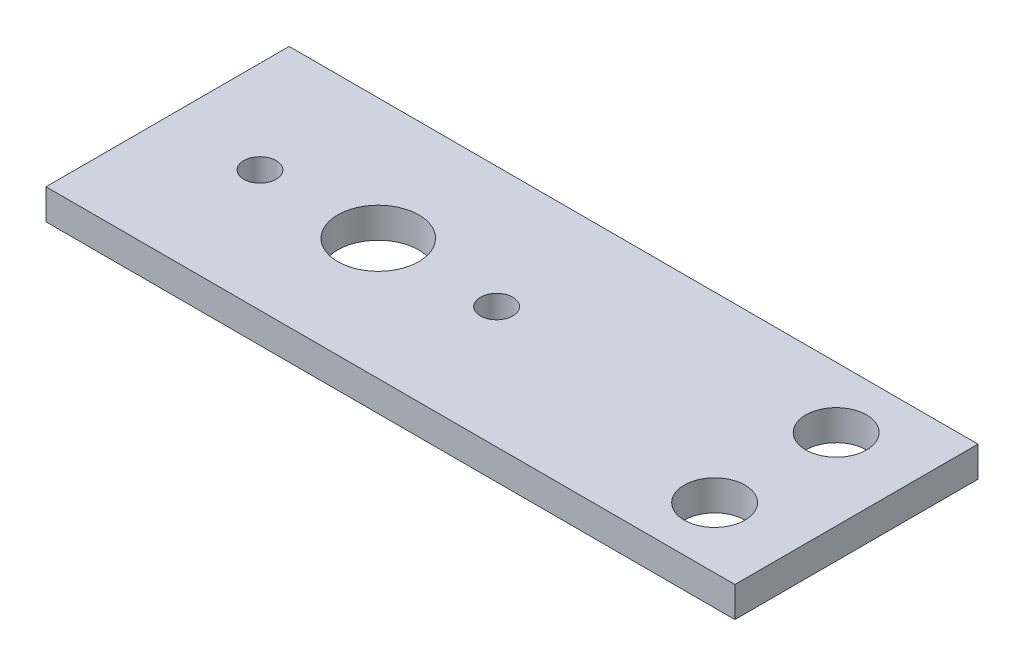
ISO-10303-21;
HEADER;
FILE_DESCRIPTION(('STEP AP214'),'2;1');
FILE_NAME('part.step','',(''),(''),'','','');
FILE_SCHEMA(('AUTOMOTIVE_DESIGN { 1 0 10303 214 1 1 1 1 }'));
ENDSEC;
DATA;
#1=APPLICATION_CONTEXT('core data for automotive mechanical design processes');
#2=APPLICATION_PROTOCOL_DEFINITION('international standard','automotive_design',2000,#1);
#3=PRODUCT_CONTEXT('',#1,'mechanical');
#4=PRODUCT('Part','Part','',(#3));
#5=PRODUCT_RELATED_PRODUCT_CATEGORY('part','',(#4));
#6=PRODUCT_DEFINITION_FORMATION('','',#4);
#7=PRODUCT_DEFINITION_CONTEXT('part definition',#1,'design');
#8=PRODUCT_DEFINITION('design','',#6,#7);
#9=PRODUCT_DEFINITION_SHAPE('','',#8);
#10=(LENGTH_UNIT() NAMED_UNIT(*) SI_UNIT(.MILLI.,.METRE.));
#11=(NAMED_UNIT(*) PLANE_ANGLE_UNIT() SI_UNIT($,.RADIAN.));
#12=(NAMED_UNIT(*) SI_UNIT($,.STERADIAN.) SOLID_ANGLE_UNIT());
#13=UNCERTAINTY_MEASURE_WITH_UNIT(LENGTH_MEASURE(1.E-05),#10,'distance_accuracy_value','');
#14=(GEOMETRIC_REPRESENTATION_CONTEXT(3) GLOBAL_UNCERTAINTY_ASSIGNED_CONTEXT((#13)) GLOBAL_UNIT_ASSIGNED_CONTEXT((#10,
#11,#12)) REPRESENTATION_CONTEXT('',''));
#15=CARTESIAN_POINT('',(0.,0.,0.));
#16=DIRECTION('',(0.,0.,1.));
#17=DIRECTION('',(1.,0.,0.));
#18=AXIS2_PLACEMENT_3D('',#15,#16,#17);
#19=CARTESIAN_POINT('',(0.,4.7625,0.));
#20=DIRECTION('',(0.,-1.,0.));
#21=DIRECTION('',(0.,0.,-1.));
#22=AXIS2_PLACEMENT_3D('',#19,#20,#21);
#23=PLANE('',#22);
#24=CARTESIAN_POINT('',(-39.497,4.7625,0.));
#25=DIRECTION('',(0.,1.,0.));
#26=DIRECTION('',(0.,0.,1.));
#27=AXIS2_PLACEMENT_3D('',#24,#25,#26);
#28=CIRCLE('',#27,2.54);
#29=CARTESIAN_POINT('',(-39.497,4.7625,2.54));
#30=VERTEX_POINT('',#29);
#31=EDGE_CURVE('E165',#30,#30,#28,.T.);
#32=ORIENTED_EDGE('',*,*,#31,.F.);
#33=EDGE_LOOP('',(#32));
#34=FACE_BOUND('',#33,.T.);
#35=CARTESIAN_POINT('',(-2.41299999999999,4.7625,0.));
#36=DIRECTION('',(0.,1.,0.));
#37=DIRECTION('',(0.,0.,1.));
#38=AXIS2_PLACEMENT_3D('',#35,#36,#37);
#39=CIRCLE('',#38,2.54);
#40=CARTESIAN_POINT('',(-2.41299999999999,4.7625,2.54));
#41=VERTEX_POINT('',#40);
#42=EDGE_CURVE('E161',#41,#41,#39,.T.);
#43=ORIENTED_EDGE('',*,*,#42,.F.);
#44=EDGE_LOOP('',(#43));
#45=FACE_BOUND('',#44,.T.);
#46=CARTESIAN_POINT('',(-20.955,4.7625,0.));
#47=DIRECTION('',(0.,1.,0.));
#48=DIRECTION('',(0.,0.,1.));
#49=AXIS2_PLACEMENT_3D('',#46,#47,#48);
#50=CIRCLE('',#49,6.35);
#51=CARTESIAN_POINT('',(-20.955,4.7625,6.35));
#52=VERTEX_POINT('',#51);
#53=EDGE_CURVE('E153',#52,#52,#50,.T.);
#54=ORIENTED_EDGE('',*,*,#53,.F.);
#55=EDGE_LOOP('',(#54));
#56=FACE_BOUND('',#55,.T.);
#57=DIRECTION('',(0.,0.,-1.));
#58=VECTOR('',#57,1.);
#59=CARTESIAN_POINT('',(53.975,4.7625,19.05));
#60=LINE('',#59,#58);
#61=CARTESIAN_POINT('',(53.975,4.7625,19.05));
#62=VERTEX_POINT('',#61);
#63=CARTESIAN_POINT('',(53.975,4.7625,-19.05));
#64=VERTEX_POINT('',#63);
#65=EDGE_CURVE('E95',#62,#64,#60,.T.);
#66=ORIENTED_EDGE('',*,*,#65,.T.);
#67=DIRECTION('',(-1.,0.,0.));
#68=VECTOR('',#67,1.);
#69=CARTESIAN_POINT('',(-53.975,4.7625,-19.05));
#70=LINE('',#69,#68);
#71=CARTESIAN_POINT('',(-53.975,4.7625,-19.05));
#72=VERTEX_POINT('',#71);
#73=EDGE_CURVE('E90',#64,#72,#70,.T.);
#74=ORIENTED_EDGE('',*,*,#73,.T.);
#75=DIRECTION('',(0.,0.,1.));
#76=VECTOR('',#75,1.);
#77=CARTESIAN_POINT('',(-53.975,4.7625,19.05));
#78=LINE('',#77,#76);
#79=CARTESIAN_POINT('',(-53.975,4.7625,19.05));
#80=VERTEX_POINT('',#79);
#81=EDGE_CURVE('E93',#72,#80,#78,.T.);
#82=ORIENTED_EDGE('',*,*,#81,.T.);
#83=DIRECTION('',(1.,0.,0.));
#84=VECTOR('',#83,1.);
#85=CARTESIAN_POINT('',(-53.975,4.7625,19.05));
#86=LINE('',#85,#84);
#87=EDGE_CURVE('E60',#80,#62,#86,.T.);
#88=ORIENTED_EDGE('',*,*,#87,.T.);
#89=EDGE_LOOP('',(#66,#74,#82,#88));
#90=FACE_BOUND('',#89,.T.);
#91=CARTESIAN_POINT('',(41.275,4.7625,-9.525));
#92=DIRECTION('',(0.,1.,0.));
#93=DIRECTION('',(0.,0.,1.));
#94=AXIS2_PLACEMENT_3D('',#91,#92,#93);
#95=CIRCLE('',#94,4.7625);
#96=CARTESIAN_POINT('',(41.275,4.7625,-14.2875));
#97=VERTEX_POINT('',#96);
#98=EDGE_CURVE('E115',#97,#97,#95,.T.);
#99=ORIENTED_EDGE('',*,*,#98,.F.);
#100=EDGE_LOOP('',(#99));
#101=FACE_BOUND('',#100,.T.);
#102=CARTESIAN_POINT('',(41.275,4.7625,9.52499999999998));
#103=DIRECTION('',(0.,1.,0.));
#104=DIRECTION('',(0.,0.,-1.));
#105=AXIS2_PLACEMENT_3D('',#102,#103,#104);
#106=CIRCLE('',#105,4.7625);
#107=CARTESIAN_POINT('',(41.275,4.7625,4.76249999999997));
#108=VERTEX_POINT('',#107);
#109=EDGE_CURVE('E137',#108,#108,#106,.T.);
#110=ORIENTED_EDGE('',*,*,#109,.F.);
#111=EDGE_LOOP('',(#110));
#112=FACE_BOUND('',#111,.T.);
#113=ADVANCED_FACE('F42',(#34,#45,#56,#90,#101,#112),#23,.F.);
#114=CARTESIAN_POINT('',(0.,0.,0.));
#115=DIRECTION('',(0.,-1.,0.));
#116=DIRECTION('',(0.,0.,-1.));
#117=AXIS2_PLACEMENT_3D('',#114,#115,#116);
#118=PLANE('',#117);
#119=CARTESIAN_POINT('',(-39.497,0.,0.));
#120=DIRECTION('',(0.,1.,0.));
#121=DIRECTION('',(0.,0.,1.));
#122=AXIS2_PLACEMENT_3D('',#119,#120,#121);
#123=CIRCLE('',#122,2.54);
#124=CARTESIAN_POINT('',(-39.497,0.,2.54));
#125=VERTEX_POINT('',#124);
#126=EDGE_CURVE('E145',#125,#125,#123,.T.);
#127=ORIENTED_EDGE('',*,*,#126,.T.);
#128=EDGE_LOOP('',(#127));
#129=FACE_BOUND('',#128,.T.);
#130=CARTESIAN_POINT('',(-2.41299999999999,0.,0.));
#131=DIRECTION('',(0.,1.,0.));
#132=DIRECTION('',(0.,0.,1.));
#133=AXIS2_PLACEMENT_3D('',#130,#131,#132);
#134=CIRCLE('',#133,2.54);
#135=CARTESIAN_POINT('',(-2.41299999999999,0.,2.54));
#136=VERTEX_POINT('',#135);
#137=EDGE_CURVE('E157',#136,#136,#134,.T.);
#138=ORIENTED_EDGE('',*,*,#137,.T.);
#139=EDGE_LOOP('',(#138));
#140=FACE_BOUND('',#139,.T.);
#141=CARTESIAN_POINT('',(-20.955,0.,0.));
#142=DIRECTION('',(0.,1.,0.));
#143=DIRECTION('',(0.,0.,1.));
#144=AXIS2_PLACEMENT_3D('',#141,#142,#143);
#145=CIRCLE('',#144,6.35);
#146=CARTESIAN_POINT('',(-20.955,0.,6.35));
#147=VERTEX_POINT('',#146);
#148=EDGE_CURVE('E149',#147,#147,#145,.T.);
#149=ORIENTED_EDGE('',*,*,#148,.T.);
#150=EDGE_LOOP('',(#149));
#151=FACE_BOUND('',#150,.T.);
#152=CARTESIAN_POINT('',(41.275,0.,-9.525));
#153=DIRECTION('',(0.,1.,0.));
#154=DIRECTION('',(0.,0.,1.));
#155=AXIS2_PLACEMENT_3D('',#152,#153,#154);
#156=CIRCLE('',#155,4.7625);
#157=CARTESIAN_POINT('',(41.275,0.,-14.2875));
#158=VERTEX_POINT('',#157);
#159=EDGE_CURVE('E133',#158,#158,#156,.T.);
#160=ORIENTED_EDGE('',*,*,#159,.T.);
#161=EDGE_LOOP('',(#160));
#162=FACE_BOUND('',#161,.T.);
#163=DIRECTION('',(0.,0.,-1.));
#164=VECTOR('',#163,1.);
#165=CARTESIAN_POINT('',(53.975,0.,19.05));
#166=LINE('',#165,#164);
#167=CARTESIAN_POINT('',(53.975,0.,19.05));
#168=VERTEX_POINT('',#167);
#169=CARTESIAN_POINT('',(53.975,0.,-19.05));
#170=VERTEX_POINT('',#169);
#171=EDGE_CURVE('E111',#168,#170,#166,.T.);
#172=ORIENTED_EDGE('',*,*,#171,.F.);
#173=DIRECTION('',(1.,0.,0.));
#174=VECTOR('',#173,1.);
#175=CARTESIAN_POINT('',(-53.975,0.,19.05));
#176=LINE('',#175,#174);
#177=CARTESIAN_POINT('',(-53.975,0.,19.05));
#178=VERTEX_POINT('',#177);
#179=EDGE_CURVE('E83',#178,#168,#176,.T.);
#180=ORIENTED_EDGE('',*,*,#179,.F.);
#181=DIRECTION('',(0.,0.,1.));
#182=VECTOR('',#181,1.);
#183=CARTESIAN_POINT('',(-53.975,0.,19.05));
#184=LINE('',#183,#182);
#185=CARTESIAN_POINT('',(-53.975,0.,-19.05));
#186=VERTEX_POINT('',#185);
#187=EDGE_CURVE('E77',#186,#178,#184,.T.);
#188=ORIENTED_EDGE('',*,*,#187,.F.);
#189=DIRECTION('',(-1.,0.,0.));
#190=VECTOR('',#189,1.);
#191=CARTESIAN_POINT('',(-53.975,0.,-19.05));
#192=LINE('',#191,#190);
#193=EDGE_CURVE('E100',#170,#186,#192,.T.);
#194=ORIENTED_EDGE('',*,*,#193,.F.);
#195=EDGE_LOOP('',(#172,#180,#188,#194));
#196=FACE_BOUND('',#195,.T.);
#197=CARTESIAN_POINT('',(41.275,0.,9.52499999999998));
#198=DIRECTION('',(0.,1.,0.));
#199=DIRECTION('',(0.,0.,-1.));
#200=AXIS2_PLACEMENT_3D('',#197,#198,#199);
#201=CIRCLE('',#200,4.7625);
#202=CARTESIAN_POINT('',(41.275,0.,4.76249999999997));
#203=VERTEX_POINT('',#202);
#204=EDGE_CURVE('E141',#203,#203,#201,.T.);
#205=ORIENTED_EDGE('',*,*,#204,.T.);
#206=EDGE_LOOP('',(#205));
#207=FACE_BOUND('',#206,.T.);
#208=ADVANCED_FACE('F128',(#129,#140,#151,#162,#196,#207),#118,.T.);
#209=CARTESIAN_POINT('',(53.975,4.7625,19.05));
#210=DIRECTION('',(-1.,0.,0.));
#211=DIRECTION('',(0.,0.,1.));
#212=AXIS2_PLACEMENT_3D('',#209,#210,#211);
#213=PLANE('',#212);
#214=ORIENTED_EDGE('',*,*,#171,.T.);
#215=DIRECTION('',(0.,-1.,0.));
#216=VECTOR('',#215,1.);
#217=CARTESIAN_POINT('',(53.975,4.7625,-19.05));
#218=LINE('',#217,#216);
#219=EDGE_CURVE('E11',#64,#170,#218,.T.);
#220=ORIENTED_EDGE('',*,*,#219,.F.);
#221=ORIENTED_EDGE('',*,*,#65,.F.);
#222=DIRECTION('',(0.,-1.,0.));
#223=VECTOR('',#222,1.);
#224=CARTESIAN_POINT('',(53.975,4.7625,19.05));
#225=LINE('',#224,#223);
#226=EDGE_CURVE('E107',#62,#168,#225,.T.);
#227=ORIENTED_EDGE('',*,*,#226,.T.);
#228=EDGE_LOOP('',(#214,#220,#221,#227));
#229=FACE_BOUND('',#228,.T.);
#230=ADVANCED_FACE('F44',(#229),#213,.F.);
#231=CARTESIAN_POINT('',(-53.975,4.7625,-19.05));
#232=DIRECTION('',(0.,0.,1.));
#233=DIRECTION('',(1.,0.,0.));
#234=AXIS2_PLACEMENT_3D('',#231,#232,#233);
#235=PLANE('',#234);
#236=ORIENTED_EDGE('',*,*,#193,.T.);
#237=DIRECTION('',(0.,-1.,0.));
#238=VECTOR('',#237,1.);
#239=CARTESIAN_POINT('',(-53.975,4.7625,-19.05));
#240=LINE('',#239,#238);
#241=EDGE_CURVE('E52',#72,#186,#240,.T.);
#242=ORIENTED_EDGE('',*,*,#241,.F.);
#243=ORIENTED_EDGE('',*,*,#73,.F.);
#244=ORIENTED_EDGE('',*,*,#219,.T.);
#245=EDGE_LOOP('',(#236,#242,#243,#244));
#246=FACE_BOUND('',#245,.T.);
#247=ADVANCED_FACE('F99',(#246),#235,.F.);
#248=CARTESIAN_POINT('',(-53.975,4.7625,19.05));
#249=DIRECTION('',(1.,0.,0.));
#250=DIRECTION('',(0.,0.,-1.));
#251=AXIS2_PLACEMENT_3D('',#248,#249,#250);
#252=PLANE('',#251);
#253=ORIENTED_EDGE('',*,*,#187,.T.);
#254=DIRECTION('',(0.,-1.,0.));
#255=VECTOR('',#254,1.);
#256=CARTESIAN_POINT('',(-53.975,4.7625,19.05));
#257=LINE('',#256,#255);
#258=EDGE_CURVE('E102',#80,#178,#257,.T.);
#259=ORIENTED_EDGE('',*,*,#258,.F.);
#260=ORIENTED_EDGE('',*,*,#81,.F.);
#261=ORIENTED_EDGE('',*,*,#241,.T.);
#262=EDGE_LOOP('',(#253,#259,#260,#261));
#263=FACE_BOUND('',#262,.T.);
#264=ADVANCED_FACE('F103',(#263),#252,.F.);
#265=CARTESIAN_POINT('',(-53.975,4.7625,19.05));
#266=DIRECTION('',(0.,0.,-1.));
#267=DIRECTION('',(-1.,0.,0.));
#268=AXIS2_PLACEMENT_3D('',#265,#266,#267);
#269=PLANE('',#268);
#270=ORIENTED_EDGE('',*,*,#179,.T.);
#271=ORIENTED_EDGE('',*,*,#226,.F.);
#272=ORIENTED_EDGE('',*,*,#87,.F.);
#273=ORIENTED_EDGE('',*,*,#258,.T.);
#274=EDGE_LOOP('',(#270,#271,#272,#273));
#275=FACE_BOUND('',#274,.T.);
#276=ADVANCED_FACE('F125',(#275),#269,.F.);
#277=CARTESIAN_POINT('',(41.275,4.7625,-9.525));
#278=DIRECTION('',(0.,-1.,0.));
#279=DIRECTION('',(0.,0.,-1.));
#280=AXIS2_PLACEMENT_3D('',#277,#278,#279);
#281=CYLINDRICAL_SURFACE('',#280,4.7625);
#282=CARTESIAN_POINT('',(41.275,4.7625,-14.2875));
#283=CARTESIAN_POINT('',(41.275,4.712890625,-14.2875));
#284=CARTESIAN_POINT('',(41.275,4.66328125,-14.2875));
#285=CARTESIAN_POINT('',(41.275,4.5640625,-14.2875));
#286=CARTESIAN_POINT('',(41.275,4.514453125,-14.2875));
#287=CARTESIAN_POINT('',(41.275,4.415234375,-14.2875));
#288=CARTESIAN_POINT('',(41.275,4.365625,-14.2875));
#289=CARTESIAN_POINT('',(41.275,4.26640625,-14.2875));
#290=CARTESIAN_POINT('',(41.275,4.216796875,-14.2875));
#291=CARTESIAN_POINT('',(41.275,4.117578125,-14.2875));
#292=CARTESIAN_POINT('',(41.275,4.06796875,-14.2875));
#293=CARTESIAN_POINT('',(41.275,3.96875,-14.2875));
#294=CARTESIAN_POINT('',(41.275,3.919140625,-14.2875));
#295=CARTESIAN_POINT('',(41.275,3.819921875,-14.2875));
#296=CARTESIAN_POINT('',(41.275,3.7703125,-14.2875));
#297=CARTESIAN_POINT('',(41.275,3.67109375,-14.2875));
#298=CARTESIAN_POINT('',(41.275,3.621484375,-14.2875));
#299=CARTESIAN_POINT('',(41.275,3.522265625,-14.2875));
#300=CARTESIAN_POINT('',(41.275,3.47265625,-14.2875));
#301=CARTESIAN_POINT('',(41.275,3.3734375,-14.2875));
#302=CARTESIAN_POINT('',(41.275,3.323828125,-14.2875));
#303=CARTESIAN_POINT('',(41.275,3.224609375,-14.2875));
#304=CARTESIAN_POINT('',(41.275,3.175,-14.2875));
#305=CARTESIAN_POINT('',(41.275,3.07578125,-14.2875));
#306=CARTESIAN_POINT('',(41.275,3.026171875,-14.2875));
#307=CARTESIAN_POINT('',(41.275,2.926953125,-14.2875));
#308=CARTESIAN_POINT('',(41.275,2.87734375,-14.2875));
#309=CARTESIAN_POINT('',(41.275,2.778125,-14.2875));
#310=CARTESIAN_POINT('',(41.275,2.728515625,-14.2875));
#311=CARTESIAN_POINT('',(41.275,2.629296875,-14.2875));
#312=CARTESIAN_POINT('',(41.275,2.5796875,-14.2875));
#313=CARTESIAN_POINT('',(41.275,2.48046875,-14.2875));
#314=CARTESIAN_POINT('',(41.275,2.430859375,-14.2875));
#315=CARTESIAN_POINT('',(41.275,2.331640625,-14.2875));
#316=CARTESIAN_POINT('',(41.275,2.28203125,-14.2875));
#317=CARTESIAN_POINT('',(41.275,2.1828125,-14.2875));
#318=CARTESIAN_POINT('',(41.275,2.133203125,-14.2875));
#319=CARTESIAN_POINT('',(41.275,2.033984375,-14.2875));
#320=CARTESIAN_POINT('',(41.275,1.984375,-14.2875));
#321=CARTESIAN_POINT('',(41.275,1.88515625,-14.2875));
#322=CARTESIAN_POINT('',(41.275,1.835546875,-14.2875));
#323=CARTESIAN_POINT('',(41.275,1.736328125,-14.2875));
#324=CARTESIAN_POINT('',(41.275,1.68671875,-14.2875));
#325=CARTESIAN_POINT('',(41.275,1.5875,-14.2875));
#326=CARTESIAN_POINT('',(41.275,1.537890625,-14.2875));
#327=CARTESIAN_POINT('',(41.275,1.438671875,-14.2875));
#328=CARTESIAN_POINT('',(41.275,1.3890625,-14.2875));
#329=CARTESIAN_POINT('',(41.275,1.28984375,-14.2875));
#330=CARTESIAN_POINT('',(41.275,1.240234375,-14.2875));
#331=CARTESIAN_POINT('',(41.275,1.141015625,-14.2875));
#332=CARTESIAN_POINT('',(41.275,1.09140625,-14.2875));
#333=CARTESIAN_POINT('',(41.275,0.992187499999999,-14.2875));
#334=CARTESIAN_POINT('',(41.275,0.942578124999999,-14.2875));
#335=CARTESIAN_POINT('',(41.275,0.843359375,-14.2875));
#336=CARTESIAN_POINT('',(41.275,0.79375,-14.2875));
#337=CARTESIAN_POINT('',(41.275,0.69453125,-14.2875));
#338=CARTESIAN_POINT('',(41.275,0.644921875,-14.2875));
#339=CARTESIAN_POINT('',(41.275,0.545703125,-14.2875));
#340=CARTESIAN_POINT('',(41.275,0.49609375,-14.2875));
#341=CARTESIAN_POINT('',(41.275,0.396875,-14.2875));
#342=CARTESIAN_POINT('',(41.275,0.347265625,-14.2875));
#343=CARTESIAN_POINT('',(41.275,0.248046875,-14.2875));
#344=CARTESIAN_POINT('',(41.275,0.1984375,-14.2875));
#345=CARTESIAN_POINT('',(41.275,0.09921875,-14.2875));
#346=CARTESIAN_POINT('',(41.275,0.049609375,-14.2875));
#347=CARTESIAN_POINT('',(41.275,0.,-14.2875));
#348=B_SPLINE_CURVE_WITH_KNOTS('',3,(#282,#283,#284,#285,#286,#287,#288,#289,#290,#291,#292,
#293,#294,#295,#296,#297,#298,#299,#300,#301,#302,#303,#304,#305,#306,#307,#308,#309,#310,#311,
#312,#313,#314,#315,#316,#317,#318,#319,#320,#321,#322,#323,#324,#325,#326,#327,#328,#329,#330,
#331,#332,#333,#334,#335,#336,#337,#338,#339,#340,#341,#342,#343,#344,#345,#346,#347),
.UNSPECIFIED.,.F.,.F.,(4,2,2,2,2,2,2,2,2,2,2,2,2,2,2,2,2,2,2,2,2,2,2,2,2,2,2,2,2,2,2,2,4),(0.,
0.148828125,0.29765625,0.446484375,0.5953125,0.744140625,0.892968750000001,1.041796875,1.190625,
1.339453125,1.48828125,1.637109375,1.7859375,1.934765625,2.08359375,2.232421875,2.38125,
2.530078125,2.67890625,2.827734375,2.9765625,3.125390625,3.27421875,3.423046875,3.571875,
3.720703125,3.86953125,4.018359375,4.1671875,4.316015625,4.46484375,4.613671875,4.7625),.UNSPECIFIED.);
#349=EDGE_CURVE('BSEAM200',#97,#158,#348,.T.);
#350=ORIENTED_EDGE('',*,*,#98,.T.);
#351=ORIENTED_EDGE('',*,*,#159,.F.);
#352=ORIENTED_EDGE('',*,*,#349,.T.);
#353=ORIENTED_EDGE('',*,*,#349,.F.);
#354=EDGE_LOOP('',(#350,#352,#351,#353));
#355=FACE_BOUND('',#354,.T.);
#356=ADVANCED_FACE('F200',(#355),#281,.F.);
#357=CARTESIAN_POINT('',(41.275,4.7625,9.52499999999998));
#358=DIRECTION('',(0.,-1.,0.));
#359=DIRECTION('',(0.,0.,-1.));
#360=AXIS2_PLACEMENT_3D('',#357,#358,#359);
#361=CYLINDRICAL_SURFACE('',#360,4.7625);
#362=CARTESIAN_POINT('',(41.275,4.7625,4.76249999999997));
#363=CARTESIAN_POINT('',(41.275,4.712890625,4.76249999999997));
#364=CARTESIAN_POINT('',(41.275,4.66328125,4.76249999999997));
#365=CARTESIAN_POINT('',(41.275,4.5640625,4.76249999999997));
#366=CARTESIAN_POINT('',(41.275,4.514453125,4.76249999999997));
#367=CARTESIAN_POINT('',(41.275,4.415234375,4.76249999999997));
#368=CARTESIAN_POINT('',(41.275,4.365625,4.76249999999997));
#369=CARTESIAN_POINT('',(41.275,4.26640625,4.76249999999997));
#370=CARTESIAN_POINT('',(41.275,4.216796875,4.76249999999997));
#371=CARTESIAN_POINT('',(41.275,4.117578125,4.76249999999997));
#372=CARTESIAN_POINT('',(41.275,4.06796875,4.76249999999997));
#373=CARTESIAN_POINT('',(41.275,3.96875,4.76249999999997));
#374=CARTESIAN_POINT('',(41.275,3.919140625,4.76249999999997));
#375=CARTESIAN_POINT('',(41.275,3.819921875,4.76249999999997));
#376=CARTESIAN_POINT('',(41.275,3.7703125,4.76249999999997));
#377=CARTESIAN_POINT('',(41.275,3.67109375,4.76249999999997));
#378=CARTESIAN_POINT('',(41.275,3.621484375,4.76249999999997));
#379=CARTESIAN_POINT('',(41.275,3.522265625,4.76249999999997));
#380=CARTESIAN_POINT('',(41.275,3.47265625,4.76249999999997));
#381=CARTESIAN_POINT('',(41.275,3.3734375,4.76249999999997));
#382=CARTESIAN_POINT('',(41.275,3.323828125,4.76249999999997));
#383=CARTESIAN_POINT('',(41.275,3.224609375,4.76249999999997));
#384=CARTESIAN_POINT('',(41.275,3.175,4.76249999999997));
#385=CARTESIAN_POINT('',(41.275,3.07578125,4.76249999999997));
#386=CARTESIAN_POINT('',(41.275,3.026171875,4.76249999999997));
#387=CARTESIAN_POINT('',(41.275,2.926953125,4.76249999999997));
#388=CARTESIAN_POINT('',(41.275,2.87734375,4.76249999999997));
#389=CARTESIAN_POINT('',(41.275,2.778125,4.76249999999997));
#390=CARTESIAN_POINT('',(41.275,2.728515625,4.76249999999997));
#391=CARTESIAN_POINT('',(41.275,2.629296875,4.76249999999997));
#392=CARTESIAN_POINT('',(41.275,2.5796875,4.76249999999997));
#393=CARTESIAN_POINT('',(41.275,2.48046875,4.76249999999997));
#394=CARTESIAN_POINT('',(41.275,2.430859375,4.76249999999997));
#395=CARTESIAN_POINT('',(41.275,2.331640625,4.76249999999997));
#396=CARTESIAN_POINT('',(41.275,2.28203125,4.76249999999997));
#397=CARTESIAN_POINT('',(41.275,2.1828125,4.76249999999997));
#398=CARTESIAN_POINT('',(41.275,2.133203125,4.76249999999997));
#399=CARTESIAN_POINT('',(41.275,2.033984375,4.76249999999997));
#400=CARTESIAN_POINT('',(41.275,1.984375,4.76249999999997));
#401=CARTESIAN_POINT('',(41.275,1.88515625,4.76249999999997));
#402=CARTESIAN_POINT('',(41.275,1.835546875,4.76249999999997));
#403=CARTESIAN_POINT('',(41.275,1.736328125,4.76249999999997));
#404=CARTESIAN_POINT('',(41.275,1.68671875,4.76249999999997));
#405=CARTESIAN_POINT('',(41.275,1.5875,4.76249999999997));
#406=CARTESIAN_POINT('',(41.275,1.537890625,4.76249999999997));
#407=CARTESIAN_POINT('',(41.275,1.438671875,4.76249999999997));
#408=CARTESIAN_POINT('',(41.275,1.3890625,4.76249999999997));
#409=CARTESIAN_POINT('',(41.275,1.28984375,4.76249999999997));
#410=CARTESIAN_POINT('',(41.275,1.240234375,4.76249999999997));
#411=CARTESIAN_POINT('',(41.275,1.141015625,4.76249999999997));
#412=CARTESIAN_POINT('',(41.275,1.09140625,4.76249999999997));
#413=CARTESIAN_POINT('',(41.275,0.992187499999999,4.76249999999997));
#414=CARTESIAN_POINT('',(41.275,0.942578124999999,4.76249999999997));
#415=CARTESIAN_POINT('',(41.275,0.843359375,4.76249999999997));
#416=CARTESIAN_POINT('',(41.275,0.79375,4.76249999999997));
#417=CARTESIAN_POINT('',(41.275,0.69453125,4.76249999999997));
#418=CARTESIAN_POINT('',(41.275,0.644921875,4.76249999999997));
#419=CARTESIAN_POINT('',(41.275,0.545703125,4.76249999999997));
#420=CARTESIAN_POINT('',(41.275,0.49609375,4.76249999999997));
#421=CARTESIAN_POINT('',(41.275,0.396875,4.76249999999997));
#422=CARTESIAN_POINT('',(41.275,0.347265625,4.76249999999997));
#423=CARTESIAN_POINT('',(41.275,0.248046875,4.76249999999997));
#424=CARTESIAN_POINT('',(41.275,0.1984375,4.76249999999997));
#425=CARTESIAN_POINT('',(41.275,0.09921875,4.76249999999997));
#426=CARTESIAN_POINT('',(41.275,0.049609375,4.76249999999997));
#427=CARTESIAN_POINT('',(41.275,0.,4.76249999999997));
#428=B_SPLINE_CURVE_WITH_KNOTS('',3,(#362,#363,#364,#365,#366,#367,#368,#369,#370,#371,#372,
#373,#374,#375,#376,#377,#378,#379,#380,#381,#382,#383,#384,#385,#386,#387,#388,#389,#390,#391,
#392,#393,#394,#395,#396,#397,#398,#399,#400,#401,#402,#403,#404,#405,#406,#407,#408,#409,#410,
#411,#412,#413,#414,#415,#416,#417,#418,#419,#420,#421,#422,#423,#424,#425,#426,#427),
.UNSPECIFIED.,.F.,.F.,(4,2,2,2,2,2,2,2,2,2,2,2,2,2,2,2,2,2,2,2,2,2,2,2,2,2,2,2,2,2,2,2,4),(0.,
0.148828125,0.29765625,0.446484375,0.5953125,0.744140625,0.892968750000001,1.041796875,1.190625,
1.339453125,1.48828125,1.637109375,1.7859375,1.934765625,2.08359375,2.232421875,2.38125,
2.530078125,2.67890625,2.827734375,2.9765625,3.125390625,3.27421875,3.423046875,3.571875,
3.720703125,3.86953125,4.018359375,4.1671875,4.316015625,4.46484375,4.613671875,4.7625),.UNSPECIFIED.);
#429=EDGE_CURVE('BSEAM191',#108,#203,#428,.T.);
#430=ORIENTED_EDGE('',*,*,#109,.T.);
#431=ORIENTED_EDGE('',*,*,#204,.F.);
#432=ORIENTED_EDGE('',*,*,#429,.T.);
#433=ORIENTED_EDGE('',*,*,#429,.F.);
#434=EDGE_LOOP('',(#430,#432,#431,#433));
#435=FACE_BOUND('',#434,.T.);
#436=ADVANCED_FACE('F191',(#435),#361,.F.);
#437=CARTESIAN_POINT('',(-20.955,0.,0.));
#438=DIRECTION('',(0.,1.,0.));
#439=DIRECTION('',(0.,0.,1.));
#440=AXIS2_PLACEMENT_3D('',#437,#438,#439);
#441=CYLINDRICAL_SURFACE('',#440,6.35);
#442=CARTESIAN_POINT('',(-20.955,0.,6.35));
#443=CARTESIAN_POINT('',(-20.955,0.049609375,6.35));
#444=CARTESIAN_POINT('',(-20.955,0.09921875,6.35));
#445=CARTESIAN_POINT('',(-20.955,0.1984375,6.35));
#446=CARTESIAN_POINT('',(-20.955,0.248046875,6.35));
#447=CARTESIAN_POINT('',(-20.955,0.347265625,6.35));
#448=CARTESIAN_POINT('',(-20.955,0.396875,6.35));
#449=CARTESIAN_POINT('',(-20.955,0.49609375,6.35));
#450=CARTESIAN_POINT('',(-20.955,0.545703125,6.35));
#451=CARTESIAN_POINT('',(-20.955,0.644921875,6.35));
#452=CARTESIAN_POINT('',(-20.955,0.69453125,6.35));
#453=CARTESIAN_POINT('',(-20.955,0.79375,6.35));
#454=CARTESIAN_POINT('',(-20.955,0.843359375,6.35));
#455=CARTESIAN_POINT('',(-20.955,0.942578125,6.35));
#456=CARTESIAN_POINT('',(-20.955,0.9921875,6.35));
#457=CARTESIAN_POINT('',(-20.955,1.09140625,6.35));
#458=CARTESIAN_POINT('',(-20.955,1.141015625,6.35));
#459=CARTESIAN_POINT('',(-20.955,1.240234375,6.35));
#460=CARTESIAN_POINT('',(-20.955,1.28984375,6.35));
#461=CARTESIAN_POINT('',(-20.955,1.3890625,6.35));
#462=CARTESIAN_POINT('',(-20.955,1.438671875,6.35));
#463=CARTESIAN_POINT('',(-20.955,1.537890625,6.35));
#464=CARTESIAN_POINT('',(-20.955,1.5875,6.35));
#465=CARTESIAN_POINT('',(-20.955,1.68671875,6.35));
#466=CARTESIAN_POINT('',(-20.955,1.736328125,6.35));
#467=CARTESIAN_POINT('',(-20.955,1.835546875,6.35));
#468=CARTESIAN_POINT('',(-20.955,1.88515625,6.35));
#469=CARTESIAN_POINT('',(-20.955,1.984375,6.35));
#470=CARTESIAN_POINT('',(-20.955,2.033984375,6.35));
#471=CARTESIAN_POINT('',(-20.955,2.133203125,6.35));
#472=CARTESIAN_POINT('',(-20.955,2.1828125,6.35));
#473=CARTESIAN_POINT('',(-20.955,2.28203125,6.35));
#474=CARTESIAN_POINT('',(-20.955,2.331640625,6.35));
#475=CARTESIAN_POINT('',(-20.955,2.430859375,6.35));
#476=CARTESIAN_POINT('',(-20.955,2.48046875,6.35));
#477=CARTESIAN_POINT('',(-20.955,2.5796875,6.35));
#478=CARTESIAN_POINT('',(-20.955,2.629296875,6.35));
#479=CARTESIAN_POINT('',(-20.955,2.728515625,6.35));
#480=CARTESIAN_POINT('',(-20.955,2.778125,6.35));
#481=CARTESIAN_POINT('',(-20.955,2.87734375,6.35));
#482=CARTESIAN_POINT('',(-20.955,2.926953125,6.35));
#483=CARTESIAN_POINT('',(-20.955,3.026171875,6.35));
#484=CARTESIAN_POINT('',(-20.955,3.07578125,6.35));
#485=CARTESIAN_POINT('',(-20.955,3.175,6.35));
#486=CARTESIAN_POINT('',(-20.955,3.224609375,6.35));
#487=CARTESIAN_POINT('',(-20.955,3.323828125,6.35));
#488=CARTESIAN_POINT('',(-20.955,3.3734375,6.35));
#489=CARTESIAN_POINT('',(-20.955,3.47265625,6.35));
#490=CARTESIAN_POINT('',(-20.955,3.522265625,6.35));
#491=CARTESIAN_POINT('',(-20.955,3.621484375,6.35));
#492=CARTESIAN_POINT('',(-20.955,3.67109375,6.35));
#493=CARTESIAN_POINT('',(-20.955,3.7703125,6.35));
#494=CARTESIAN_POINT('',(-20.955,3.819921875,6.35));
#495=CARTESIAN_POINT('',(-20.955,3.919140625,6.35));
#496=CARTESIAN_POINT('',(-20.955,3.96875,6.35));
#497=CARTESIAN_POINT('',(-20.955,4.06796875,6.35));
#498=CARTESIAN_POINT('',(-20.955,4.117578125,6.35));
#499=CARTESIAN_POINT('',(-20.955,4.216796875,6.35));
#500=CARTESIAN_POINT('',(-20.955,4.26640625,6.35));
#501=CARTESIAN_POINT('',(-20.955,4.365625,6.35));
#502=CARTESIAN_POINT('',(-20.955,4.415234375,6.35));
#503=CARTESIAN_POINT('',(-20.955,4.514453125,6.35));
#504=CARTESIAN_POINT('',(-20.955,4.5640625,6.35));
#505=CARTESIAN_POINT('',(-20.955,4.66328125,6.35));
#506=CARTESIAN_POINT('',(-20.955,4.712890625,6.35));
#507=CARTESIAN_POINT('',(-20.955,4.7625,6.35));
#508=B_SPLINE_CURVE_WITH_KNOTS('',3,(#442,#443,#444,#445,#446,#447,#448,#449,#450,#451,#452,
#453,#454,#455,#456,#457,#458,#459,#460,#461,#462,#463,#464,#465,#466,#467,#468,#469,#470,#471,
#472,#473,#474,#475,#476,#477,#478,#479,#480,#481,#482,#483,#484,#485,#486,#487,#488,#489,#490,
#491,#492,#493,#494,#495,#496,#497,#498,#499,#500,#501,#502,#503,#504,#505,#506,#507),
.UNSPECIFIED.,.F.,.F.,(4,2,2,2,2,2,2,2,2,2,2,2,2,2,2,2,2,2,2,2,2,2,2,2,2,2,2,2,2,2,2,2,4),(0.,
0.148828125,0.29765625,0.446484375,0.5953125,0.744140625,0.89296875,1.041796875,1.190625,
1.339453125,1.48828125,1.637109375,1.7859375,1.934765625,2.08359375,2.232421875,2.38125,
2.530078125,2.67890625,2.827734375,2.9765625,3.125390625,3.27421875,3.423046875,3.571875,
3.720703125,3.86953125,4.018359375,4.1671875,4.316015625,4.46484375,4.613671875,4.7625),.UNSPECIFIED.);
#509=EDGE_CURVE('BSEAM189',#147,#52,#508,.T.);
#510=ORIENTED_EDGE('',*,*,#148,.F.);
#511=ORIENTED_EDGE('',*,*,#53,.T.);
#512=ORIENTED_EDGE('',*,*,#509,.T.);
#513=ORIENTED_EDGE('',*,*,#509,.F.);
#514=EDGE_LOOP('',(#510,#512,#511,#513));
#515=FACE_BOUND('',#514,.T.);
#516=ADVANCED_FACE('F189',(#515),#441,.F.);
#517=CARTESIAN_POINT('',(-2.41299999999999,0.,0.));
#518=DIRECTION('',(0.,1.,0.));
#519=DIRECTION('',(0.,0.,1.));
#520=AXIS2_PLACEMENT_3D('',#517,#518,#519);
#521=CYLINDRICAL_SURFACE('',#520,2.54);
#522=CARTESIAN_POINT('',(-2.41299999999999,0.,2.54));
#523=CARTESIAN_POINT('',(-2.41299999999999,0.049609375,2.54));
#524=CARTESIAN_POINT('',(-2.41299999999999,0.09921875,2.54));
#525=CARTESIAN_POINT('',(-2.41299999999999,0.1984375,2.54));
#526=CARTESIAN_POINT('',(-2.41299999999999,0.248046875,2.54));
#527=CARTESIAN_POINT('',(-2.41299999999999,0.347265625,2.54));
#528=CARTESIAN_POINT('',(-2.41299999999999,0.396875,2.54));
#529=CARTESIAN_POINT('',(-2.41299999999999,0.49609375,2.54));
#530=CARTESIAN_POINT('',(-2.41299999999999,0.545703125,2.54));
#531=CARTESIAN_POINT('',(-2.41299999999999,0.644921875,2.54));
#532=CARTESIAN_POINT('',(-2.41299999999999,0.69453125,2.54));
#533=CARTESIAN_POINT('',(-2.41299999999999,0.79375,2.54));
#534=CARTESIAN_POINT('',(-2.41299999999999,0.843359375,2.54));
#535=CARTESIAN_POINT('',(-2.41299999999999,0.942578125,2.54));
#536=CARTESIAN_POINT('',(-2.41299999999999,0.9921875,2.54));
#537=CARTESIAN_POINT('',(-2.41299999999999,1.09140625,2.54));
#538=CARTESIAN_POINT('',(-2.41299999999999,1.141015625,2.54));
#539=CARTESIAN_POINT('',(-2.41299999999999,1.240234375,2.54));
#540=CARTESIAN_POINT('',(-2.41299999999999,1.28984375,2.54));
#541=CARTESIAN_POINT('',(-2.41299999999999,1.3890625,2.54));
#542=CARTESIAN_POINT('',(-2.41299999999999,1.438671875,2.54));
#543=CARTESIAN_POINT('',(-2.41299999999999,1.537890625,2.54));
#544=CARTESIAN_POINT('',(-2.41299999999999,1.5875,2.54));
#545=CARTESIAN_POINT('',(-2.41299999999999,1.68671875,2.54));
#546=CARTESIAN_POINT('',(-2.41299999999999,1.736328125,2.54));
#547=CARTESIAN_POINT('',(-2.41299999999999,1.835546875,2.54));
#548=CARTESIAN_POINT('',(-2.41299999999999,1.88515625,2.54));
#549=CARTESIAN_POINT('',(-2.41299999999999,1.984375,2.54));
#550=CARTESIAN_POINT('',(-2.41299999999999,2.033984375,2.54));
#551=CARTESIAN_POINT('',(-2.41299999999999,2.133203125,2.54));
#552=CARTESIAN_POINT('',(-2.41299999999999,2.1828125,2.54));
#553=CARTESIAN_POINT('',(-2.41299999999999,2.28203125,2.54));
#554=CARTESIAN_POINT('',(-2.41299999999999,2.331640625,2.54));
#555=CARTESIAN_POINT('',(-2.41299999999999,2.430859375,2.54));
#556=CARTESIAN_POINT('',(-2.41299999999999,2.48046875,2.54));
#557=CARTESIAN_POINT('',(-2.41299999999999,2.5796875,2.54));
#558=CARTESIAN_POINT('',(-2.41299999999999,2.629296875,2.54));
#559=CARTESIAN_POINT('',(-2.41299999999999,2.728515625,2.54));
#560=CARTESIAN_POINT('',(-2.41299999999999,2.778125,2.54));
#561=CARTESIAN_POINT('',(-2.41299999999999,2.87734375,2.54));
#562=CARTESIAN_POINT('',(-2.41299999999999,2.926953125,2.54));
#563=CARTESIAN_POINT('',(-2.41299999999999,3.026171875,2.54));
#564=CARTESIAN_POINT('',(-2.41299999999999,3.07578125,2.54));
#565=CARTESIAN_POINT('',(-2.41299999999999,3.175,2.54));
#566=CARTESIAN_POINT('',(-2.41299999999999,3.224609375,2.54));
#567=CARTESIAN_POINT('',(-2.41299999999999,3.323828125,2.54));
#568=CARTESIAN_POINT('',(-2.41299999999999,3.3734375,2.54));
#569=CARTESIAN_POINT('',(-2.41299999999999,3.47265625,2.54));
#570=CARTESIAN_POINT('',(-2.41299999999999,3.522265625,2.54));
#571=CARTESIAN_POINT('',(-2.41299999999999,3.621484375,2.54));
#572=CARTESIAN_POINT('',(-2.41299999999999,3.67109375,2.54));
#573=CARTESIAN_POINT('',(-2.41299999999999,3.7703125,2.54));
#574=CARTESIAN_POINT('',(-2.41299999999999,3.819921875,2.54));
#575=CARTESIAN_POINT('',(-2.41299999999999,3.919140625,2.54));
#576=CARTESIAN_POINT('',(-2.41299999999999,3.96875,2.54));
#577=CARTESIAN_POINT('',(-2.41299999999999,4.06796875,2.54));
#578=CARTESIAN_POINT('',(-2.41299999999999,4.117578125,2.54));
#579=CARTESIAN_POINT('',(-2.41299999999999,4.216796875,2.54));
#580=CARTESIAN_POINT('',(-2.41299999999999,4.26640625,2.54));
#581=CARTESIAN_POINT('',(-2.41299999999999,4.365625,2.54));
#582=CARTESIAN_POINT('',(-2.41299999999999,4.415234375,2.54));
#583=CARTESIAN_POINT('',(-2.41299999999999,4.514453125,2.54));
#584=CARTESIAN_POINT('',(-2.41299999999999,4.5640625,2.54));
#585=CARTESIAN_POINT('',(-2.41299999999999,4.66328125,2.54));
#586=CARTESIAN_POINT('',(-2.41299999999999,4.712890625,2.54));
#587=CARTESIAN_POINT('',(-2.41299999999999,4.7625,2.54));
#588=B_SPLINE_CURVE_WITH_KNOTS('',3,(#522,#523,#524,#525,#526,#527,#528,#529,#530,#531,#532,
#533,#534,#535,#536,#537,#538,#539,#540,#541,#542,#543,#544,#545,#546,#547,#548,#549,#550,#551,
#552,#553,#554,#555,#556,#557,#558,#559,#560,#561,#562,#563,#564,#565,#566,#567,#568,#569,#570,
#571,#572,#573,#574,#575,#576,#577,#578,#579,#580,#581,#582,#583,#584,#585,#586,#587),
.UNSPECIFIED.,.F.,.F.,(4,2,2,2,2,2,2,2,2,2,2,2,2,2,2,2,2,2,2,2,2,2,2,2,2,2,2,2,2,2,2,2,4),(0.,
0.148828125,0.29765625,0.446484375,0.5953125,0.744140625,0.89296875,1.041796875,1.190625,
1.339453125,1.48828125,1.637109375,1.7859375,1.934765625,2.08359375,2.232421875,2.38125,
2.530078125,2.67890625,2.827734375,2.9765625,3.125390625,3.27421875,3.423046875,3.571875,
3.720703125,3.86953125,4.018359375,4.1671875,4.316015625,4.46484375,4.613671875,4.7625),.UNSPECIFIED.);
#589=EDGE_CURVE('BSEAM178',#136,#41,#588,.T.);
#590=ORIENTED_EDGE('',*,*,#137,.F.);
#591=ORIENTED_EDGE('',*,*,#42,.T.);
#592=ORIENTED_EDGE('',*,*,#589,.T.);
#593=ORIENTED_EDGE('',*,*,#589,.F.);
#594=EDGE_LOOP('',(#590,#592,#591,#593));
#595=FACE_BOUND('',#594,.T.);
#596=ADVANCED_FACE('F178',(#595),#521,.F.);
#597=CARTESIAN_POINT('',(-39.497,0.,0.));
#598=DIRECTION('',(0.,1.,0.));
#599=DIRECTION('',(0.,0.,1.));
#600=AXIS2_PLACEMENT_3D('',#597,#598,#599);
#601=CYLINDRICAL_SURFACE('',#600,2.54);
#602=CARTESIAN_POINT('',(-39.497,0.,2.54));
#603=CARTESIAN_POINT('',(-39.497,0.049609375,2.54));
#604=CARTESIAN_POINT('',(-39.497,0.09921875,2.54));
#605=CARTESIAN_POINT('',(-39.497,0.1984375,2.54));
#606=CARTESIAN_POINT('',(-39.497,0.248046875,2.54));
#607=CARTESIAN_POINT('',(-39.497,0.347265625,2.54));
#608=CARTESIAN_POINT('',(-39.497,0.396875,2.54));
#609=CARTESIAN_POINT('',(-39.497,0.49609375,2.54));
#610=CARTESIAN_POINT('',(-39.497,0.545703125,2.54));
#611=CARTESIAN_POINT('',(-39.497,0.644921875,2.54));
#612=CARTESIAN_POINT('',(-39.497,0.69453125,2.54));
#613=CARTESIAN_POINT('',(-39.497,0.79375,2.54));
#614=CARTESIAN_POINT('',(-39.497,0.843359375,2.54));
#615=CARTESIAN_POINT('',(-39.497,0.942578125,2.54));
#616=CARTESIAN_POINT('',(-39.497,0.9921875,2.54));
#617=CARTESIAN_POINT('',(-39.497,1.09140625,2.54));
#618=CARTESIAN_POINT('',(-39.497,1.141015625,2.54));
#619=CARTESIAN_POINT('',(-39.497,1.240234375,2.54));
#620=CARTESIAN_POINT('',(-39.497,1.28984375,2.54));
#621=CARTESIAN_POINT('',(-39.497,1.3890625,2.54));
#622=CARTESIAN_POINT('',(-39.497,1.438671875,2.54));
#623=CARTESIAN_POINT('',(-39.497,1.537890625,2.54));
#624=CARTESIAN_POINT('',(-39.497,1.5875,2.54));
#625=CARTESIAN_POINT('',(-39.497,1.68671875,2.54));
#626=CARTESIAN_POINT('',(-39.497,1.736328125,2.54));
#627=CARTESIAN_POINT('',(-39.497,1.835546875,2.54));
#628=CARTESIAN_POINT('',(-39.497,1.88515625,2.54));
#629=CARTESIAN_POINT('',(-39.497,1.984375,2.54));
#630=CARTESIAN_POINT('',(-39.497,2.033984375,2.54));
#631=CARTESIAN_POINT('',(-39.497,2.133203125,2.54));
#632=CARTESIAN_POINT('',(-39.497,2.1828125,2.54));
#633=CARTESIAN_POINT('',(-39.497,2.28203125,2.54));
#634=CARTESIAN_POINT('',(-39.497,2.331640625,2.54));
#635=CARTESIAN_POINT('',(-39.497,2.430859375,2.54));
#636=CARTESIAN_POINT('',(-39.497,2.48046875,2.54));
#637=CARTESIAN_POINT('',(-39.497,2.5796875,2.54));
#638=CARTESIAN_POINT('',(-39.497,2.629296875,2.54));
#639=CARTESIAN_POINT('',(-39.497,2.728515625,2.54));
#640=CARTESIAN_POINT('',(-39.497,2.778125,2.54));
#641=CARTESIAN_POINT('',(-39.497,2.87734375,2.54));
#642=CARTESIAN_POINT('',(-39.497,2.926953125,2.54));
#643=CARTESIAN_POINT('',(-39.497,3.026171875,2.54));
#644=CARTESIAN_POINT('',(-39.497,3.07578125,2.54));
#645=CARTESIAN_POINT('',(-39.497,3.175,2.54));
#646=CARTESIAN_POINT('',(-39.497,3.224609375,2.54));
#647=CARTESIAN_POINT('',(-39.497,3.323828125,2.54));
#648=CARTESIAN_POINT('',(-39.497,3.3734375,2.54));
#649=CARTESIAN_POINT('',(-39.497,3.47265625,2.54));
#650=CARTESIAN_POINT('',(-39.497,3.522265625,2.54));
#651=CARTESIAN_POINT('',(-39.497,3.621484375,2.54));
#652=CARTESIAN_POINT('',(-39.497,3.67109375,2.54));
#653=CARTESIAN_POINT('',(-39.497,3.7703125,2.54));
#654=CARTESIAN_POINT('',(-39.497,3.819921875,2.54));
#655=CARTESIAN_POINT('',(-39.497,3.919140625,2.54));
#656=CARTESIAN_POINT('',(-39.497,3.96875,2.54));
#657=CARTESIAN_POINT('',(-39.497,4.06796875,2.54));
#658=CARTESIAN_POINT('',(-39.497,4.117578125,2.54));
#659=CARTESIAN_POINT('',(-39.497,4.216796875,2.54));
#660=CARTESIAN_POINT('',(-39.497,4.26640625,2.54));
#661=CARTESIAN_POINT('',(-39.497,4.365625,2.54));
#662=CARTESIAN_POINT('',(-39.497,4.415234375,2.54));
#663=CARTESIAN_POINT('',(-39.497,4.514453125,2.54));
#664=CARTESIAN_POINT('',(-39.497,4.5640625,2.54));
#665=CARTESIAN_POINT('',(-39.497,4.66328125,2.54));
#666=CARTESIAN_POINT('',(-39.497,4.712890625,2.54));
#667=CARTESIAN_POINT('',(-39.497,4.7625,2.54));
#668=B_SPLINE_CURVE_WITH_KNOTS('',3,(#602,#603,#604,#605,#606,#607,#608,#609,#610,#611,#612,
#613,#614,#615,#616,#617,#618,#619,#620,#621,#622,#623,#624,#625,#626,#627,#628,#629,#630,#631,
#632,#633,#634,#635,#636,#637,#638,#639,#640,#641,#642,#643,#644,#645,#646,#647,#648,#649,#650,
#651,#652,#653,#654,#655,#656,#657,#658,#659,#660,#661,#662,#663,#664,#665,#666,#667),
.UNSPECIFIED.,.F.,.F.,(4,2,2,2,2,2,2,2,2,2,2,2,2,2,2,2,2,2,2,2,2,2,2,2,2,2,2,2,2,2,2,2,4),(0.,
0.148828125,0.29765625,0.446484375,0.5953125,0.744140625,0.89296875,1.041796875,1.190625,
1.339453125,1.48828125,1.637109375,1.7859375,1.934765625,2.08359375,2.232421875,2.38125,
2.530078125,2.67890625,2.827734375,2.9765625,3.125390625,3.27421875,3.423046875,3.571875,
3.720703125,3.86953125,4.018359375,4.1671875,4.316015625,4.46484375,4.613671875,4.7625),.UNSPECIFIED.);
#669=EDGE_CURVE('BSEAM175',#125,#30,#668,.T.);
#670=ORIENTED_EDGE('',*,*,#126,.F.);
#671=ORIENTED_EDGE('',*,*,#31,.T.);
#672=ORIENTED_EDGE('',*,*,#669,.T.);
#673=ORIENTED_EDGE('',*,*,#669,.F.);
#674=EDGE_LOOP('',(#670,#672,#671,#673));
#675=FACE_BOUND('',#674,.T.);
#676=ADVANCED_FACE('F175',(#675),#601,.F.);
#677=CLOSED_SHELL('',(#113,#208,#230,#247,#264,#276,#356,#436,#516,#596,#676));
#678=MANIFOLD_SOLID_BREP('B2',#677);
#679=ADVANCED_BREP_SHAPE_REPRESENTATION('',(#18,#678),#14);
#680=SHAPE_DEFINITION_REPRESENTATION(#9,#679);
ENDSEC;
END-ISO-10303-21;
